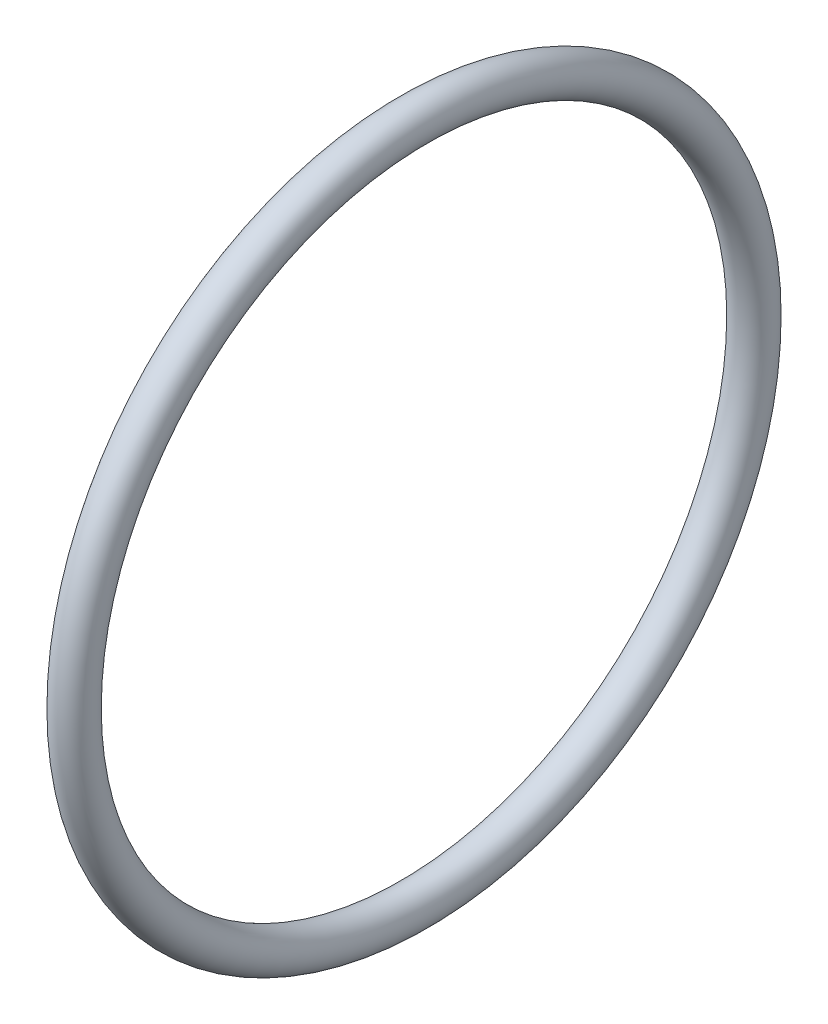
ISO-10303-21;
HEADER;
FILE_DESCRIPTION(('STEP AP214'),'2;1');
FILE_NAME('part.step','',(''),(''),'','','');
FILE_SCHEMA(('AUTOMOTIVE_DESIGN { 1 0 10303 214 1 1 1 1 }'));
ENDSEC;
DATA;
#1=APPLICATION_CONTEXT('core data for automotive mechanical design processes');
#2=APPLICATION_PROTOCOL_DEFINITION('international standard','automotive_design',2000,#1);
#3=PRODUCT_CONTEXT('',#1,'mechanical');
#4=PRODUCT('Part','Part','',(#3));
#5=PRODUCT_RELATED_PRODUCT_CATEGORY('part','',(#4));
#6=PRODUCT_DEFINITION_FORMATION('','',#4);
#7=PRODUCT_DEFINITION_CONTEXT('part definition',#1,'design');
#8=PRODUCT_DEFINITION('design','',#6,#7);
#9=PRODUCT_DEFINITION_SHAPE('','',#8);
#10=(LENGTH_UNIT() NAMED_UNIT(*) SI_UNIT(.MILLI.,.METRE.));
#11=(NAMED_UNIT(*) PLANE_ANGLE_UNIT() SI_UNIT($,.RADIAN.));
#12=(NAMED_UNIT(*) SI_UNIT($,.STERADIAN.) SOLID_ANGLE_UNIT());
#13=UNCERTAINTY_MEASURE_WITH_UNIT(LENGTH_MEASURE(1.E-05),#10,'distance_accuracy_value','');
#14=(GEOMETRIC_REPRESENTATION_CONTEXT(3) GLOBAL_UNCERTAINTY_ASSIGNED_CONTEXT((#13)) GLOBAL_UNIT_ASSIGNED_CONTEXT((#10,
#11,#12)) REPRESENTATION_CONTEXT('',''));
#15=CARTESIAN_POINT('',(0.,0.,0.));
#16=DIRECTION('',(0.,0.,1.));
#17=DIRECTION('',(1.,0.,0.));
#18=AXIS2_PLACEMENT_3D('',#15,#16,#17);
#19=CARTESIAN_POINT('',(0.,0.750060804596234,0.));
#20=DIRECTION('',(-1.,0.,0.));
#21=DIRECTION('',(0.,0.,1.));
#22=AXIS2_PLACEMENT_3D('',#19,#20,#21);
#23=TOROIDAL_SURFACE('',#22,26.5,1.5);
#24=CARTESIAN_POINT('',(0.,0.750060804596234,28.));
#25=VERTEX_POINT('',#24);
#26=VERTEX_LOOP('',#25);
#27=FACE_BOUND('',#26,.T.);
#28=ADVANCED_FACE('F28',(#27),#23,.T.);
#29=CLOSED_SHELL('',(#28));
#30=MANIFOLD_SOLID_BREP('B2',#29);
#31=ADVANCED_BREP_SHAPE_REPRESENTATION('',(#18,#30),#14);
#32=SHAPE_DEFINITION_REPRESENTATION(#9,#31);
ENDSEC;
END-ISO-10303-21;
